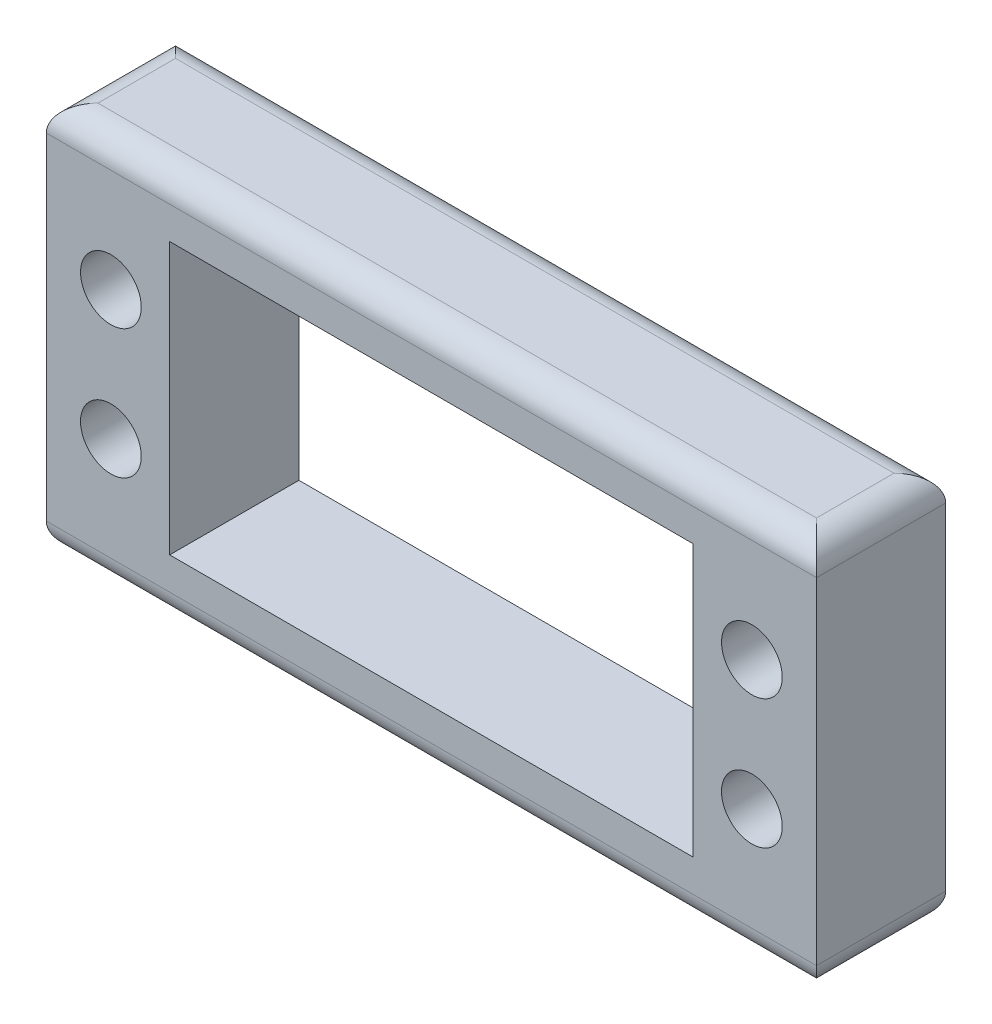
ISO-10303-21;
HEADER;
FILE_DESCRIPTION(('STEP AP214'),'2;1');
FILE_NAME('part.step','',(''),(''),'','','');
FILE_SCHEMA(('AUTOMOTIVE_DESIGN { 1 0 10303 214 1 1 1 1 }'));
ENDSEC;
DATA;
#1=APPLICATION_CONTEXT('core data for automotive mechanical design processes');
#2=APPLICATION_PROTOCOL_DEFINITION('international standard','automotive_design',2000,#1);
#3=PRODUCT_CONTEXT('',#1,'mechanical');
#4=PRODUCT('Part','Part','',(#3));
#5=PRODUCT_RELATED_PRODUCT_CATEGORY('part','',(#4));
#6=PRODUCT_DEFINITION_FORMATION('','',#4);
#7=PRODUCT_DEFINITION_CONTEXT('part definition',#1,'design');
#8=PRODUCT_DEFINITION('design','',#6,#7);
#9=PRODUCT_DEFINITION_SHAPE('','',#8);
#10=(LENGTH_UNIT() NAMED_UNIT(*) SI_UNIT(.MILLI.,.METRE.));
#11=(NAMED_UNIT(*) PLANE_ANGLE_UNIT() SI_UNIT($,.RADIAN.));
#12=(NAMED_UNIT(*) SI_UNIT($,.STERADIAN.) SOLID_ANGLE_UNIT());
#13=UNCERTAINTY_MEASURE_WITH_UNIT(LENGTH_MEASURE(1.E-05),#10,'distance_accuracy_value','');
#14=(GEOMETRIC_REPRESENTATION_CONTEXT(3) GLOBAL_UNCERTAINTY_ASSIGNED_CONTEXT((#13)) GLOBAL_UNIT_ASSIGNED_CONTEXT((#10,
#11,#12)) REPRESENTATION_CONTEXT('',''));
#15=CARTESIAN_POINT('',(0.,0.,0.));
#16=DIRECTION('',(0.,0.,1.));
#17=DIRECTION('',(1.,0.,0.));
#18=AXIS2_PLACEMENT_3D('',#15,#16,#17);
#19=CARTESIAN_POINT('',(0.,0.,10.));
#20=DIRECTION('',(0.,0.,1.));
#21=DIRECTION('',(1.,0.,0.));
#22=AXIS2_PLACEMENT_3D('',#19,#20,#21);
#23=PLANE('',#22);
#24=CARTESIAN_POINT('',(24.8,-5.,10.));
#25=DIRECTION('',(0.,0.,1.));
#26=DIRECTION('',(-1.,0.,0.));
#27=AXIS2_PLACEMENT_3D('',#24,#25,#26);
#28=CIRCLE('',#27,2.35);
#29=CARTESIAN_POINT('',(22.45,-5.,10.));
#30=VERTEX_POINT('',#29);
#31=EDGE_CURVE('E177',#30,#30,#28,.T.);
#32=ORIENTED_EDGE('',*,*,#31,.F.);
#33=EDGE_LOOP('',(#32));
#34=FACE_BOUND('',#33,.T.);
#35=CARTESIAN_POINT('',(-24.8,5.00000000000001,10.));
#36=DIRECTION('',(0.,0.,1.));
#37=DIRECTION('',(1.,0.,0.));
#38=AXIS2_PLACEMENT_3D('',#35,#36,#37);
#39=CIRCLE('',#38,2.34999999999999);
#40=CARTESIAN_POINT('',(-22.45,5.00000000000001,10.));
#41=VERTEX_POINT('',#40);
#42=EDGE_CURVE('E187',#41,#41,#39,.T.);
#43=ORIENTED_EDGE('',*,*,#42,.F.);
#44=EDGE_LOOP('',(#43));
#45=FACE_BOUND('',#44,.T.);
#46=DIRECTION('',(0.,-1.,0.));
#47=VECTOR('',#46,1.);
#48=CARTESIAN_POINT('',(-29.8,15.,10.));
#49=LINE('',#48,#47);
#50=CARTESIAN_POINT('',(-29.8,13.,10.));
#51=VERTEX_POINT('',#50);
#52=CARTESIAN_POINT('',(-29.8,-13.,10.));
#53=VERTEX_POINT('',#52);
#54=EDGE_CURVE('E195',#51,#53,#49,.T.);
#55=ORIENTED_EDGE('',*,*,#54,.T.);
#56=DIRECTION('',(1.,0.,0.));
#57=VECTOR('',#56,1.);
#58=CARTESIAN_POINT('',(29.8,-13.,10.));
#59=LINE('',#58,#57);
#60=CARTESIAN_POINT('',(29.8,-13.,10.));
#61=VERTEX_POINT('',#60);
#62=EDGE_CURVE('E225',#53,#61,#59,.T.);
#63=ORIENTED_EDGE('',*,*,#62,.T.);
#64=DIRECTION('',(0.,1.,0.));
#65=VECTOR('',#64,1.);
#66=CARTESIAN_POINT('',(29.8,15.,10.));
#67=LINE('',#66,#65);
#68=CARTESIAN_POINT('',(29.8,13.,10.));
#69=VERTEX_POINT('',#68);
#70=EDGE_CURVE('E196',#61,#69,#67,.T.);
#71=ORIENTED_EDGE('',*,*,#70,.T.);
#72=DIRECTION('',(-1.,0.,0.));
#73=VECTOR('',#72,1.);
#74=CARTESIAN_POINT('',(-29.8,13.,10.));
#75=LINE('',#74,#73);
#76=EDGE_CURVE('E219',#69,#51,#75,.T.);
#77=ORIENTED_EDGE('',*,*,#76,.T.);
#78=EDGE_LOOP('',(#55,#63,#71,#77));
#79=FACE_BOUND('',#78,.T.);
#80=CARTESIAN_POINT('',(24.8,5.00000000000002,10.));
#81=DIRECTION('',(0.,0.,1.));
#82=DIRECTION('',(1.,0.,0.));
#83=AXIS2_PLACEMENT_3D('',#80,#81,#82);
#84=CIRCLE('',#83,2.34999999999998);
#85=CARTESIAN_POINT('',(27.15,5.00000000000002,10.));
#86=VERTEX_POINT('',#85);
#87=EDGE_CURVE('E181',#86,#86,#84,.T.);
#88=ORIENTED_EDGE('',*,*,#87,.F.);
#89=EDGE_LOOP('',(#88));
#90=FACE_BOUND('',#89,.T.);
#91=CARTESIAN_POINT('',(-24.8,-4.99999999999999,10.));
#92=DIRECTION('',(0.,0.,1.));
#93=DIRECTION('',(-1.,0.,0.));
#94=AXIS2_PLACEMENT_3D('',#91,#92,#93);
#95=CIRCLE('',#94,2.35);
#96=CARTESIAN_POINT('',(-27.15,-4.99999999999999,10.));
#97=VERTEX_POINT('',#96);
#98=EDGE_CURVE('E173',#97,#97,#95,.T.);
#99=ORIENTED_EDGE('',*,*,#98,.F.);
#100=EDGE_LOOP('',(#99));
#101=FACE_BOUND('',#100,.T.);
#102=DIRECTION('',(-1.,0.,0.));
#103=VECTOR('',#102,1.);
#104=CARTESIAN_POINT('',(-20.25,10.5,10.));
#105=LINE('',#104,#103);
#106=CARTESIAN_POINT('',(20.25,10.5,10.));
#107=VERTEX_POINT('',#106);
#108=CARTESIAN_POINT('',(-20.25,10.5,10.));
#109=VERTEX_POINT('',#108);
#110=EDGE_CURVE('E138',#107,#109,#105,.T.);
#111=ORIENTED_EDGE('',*,*,#110,.F.);
#112=DIRECTION('',(0.,1.,0.));
#113=VECTOR('',#112,1.);
#114=CARTESIAN_POINT('',(20.25,10.5,10.));
#115=LINE('',#114,#113);
#116=CARTESIAN_POINT('',(20.25,-10.5,10.));
#117=VERTEX_POINT('',#116);
#118=EDGE_CURVE('E129',#117,#107,#115,.T.);
#119=ORIENTED_EDGE('',*,*,#118,.F.);
#120=DIRECTION('',(1.,0.,0.));
#121=VECTOR('',#120,1.);
#122=CARTESIAN_POINT('',(-20.25,-10.5,10.));
#123=LINE('',#122,#121);
#124=CARTESIAN_POINT('',(-20.25,-10.5,10.));
#125=VERTEX_POINT('',#124);
#126=EDGE_CURVE('E152',#125,#117,#123,.T.);
#127=ORIENTED_EDGE('',*,*,#126,.F.);
#128=DIRECTION('',(0.,-1.,0.));
#129=VECTOR('',#128,1.);
#130=CARTESIAN_POINT('',(-20.25,10.5,10.));
#131=LINE('',#130,#129);
#132=EDGE_CURVE('E155',#109,#125,#131,.T.);
#133=ORIENTED_EDGE('',*,*,#132,.F.);
#134=EDGE_LOOP('',(#111,#119,#127,#133));
#135=FACE_BOUND('',#134,.T.);
#136=ADVANCED_FACE('F39',(#34,#45,#79,#90,#101,#135),#23,.T.);
#137=CARTESIAN_POINT('',(0.,0.,0.));
#138=DIRECTION('',(0.,0.,1.));
#139=DIRECTION('',(1.,0.,0.));
#140=AXIS2_PLACEMENT_3D('',#137,#138,#139);
#141=PLANE('',#140);
#142=CARTESIAN_POINT('',(-24.8,-4.99999999999999,0.));
#143=DIRECTION('',(0.,0.,1.));
#144=DIRECTION('',(-1.,0.,0.));
#145=AXIS2_PLACEMENT_3D('',#142,#143,#144);
#146=CIRCLE('',#145,2.35);
#147=CARTESIAN_POINT('',(-27.15,-4.99999999999999,0.));
#148=VERTEX_POINT('',#147);
#149=EDGE_CURVE('E150',#148,#148,#146,.T.);
#150=ORIENTED_EDGE('',*,*,#149,.T.);
#151=EDGE_LOOP('',(#150));
#152=FACE_BOUND('',#151,.T.);
#153=CARTESIAN_POINT('',(24.8,-5.,0.));
#154=DIRECTION('',(0.,0.,1.));
#155=DIRECTION('',(-1.,0.,0.));
#156=AXIS2_PLACEMENT_3D('',#153,#154,#155);
#157=CIRCLE('',#156,2.35);
#158=CARTESIAN_POINT('',(22.45,-5.,0.));
#159=VERTEX_POINT('',#158);
#160=EDGE_CURVE('E172',#159,#159,#157,.T.);
#161=ORIENTED_EDGE('',*,*,#160,.T.);
#162=EDGE_LOOP('',(#161));
#163=FACE_BOUND('',#162,.T.);
#164=CARTESIAN_POINT('',(24.8,5.00000000000002,0.));
#165=DIRECTION('',(0.,0.,1.));
#166=DIRECTION('',(1.,0.,0.));
#167=AXIS2_PLACEMENT_3D('',#164,#165,#166);
#168=CIRCLE('',#167,2.34999999999998);
#169=CARTESIAN_POINT('',(27.15,5.00000000000002,0.));
#170=VERTEX_POINT('',#169);
#171=EDGE_CURVE('E180',#170,#170,#168,.T.);
#172=ORIENTED_EDGE('',*,*,#171,.T.);
#173=EDGE_LOOP('',(#172));
#174=FACE_BOUND('',#173,.T.);
#175=CARTESIAN_POINT('',(-24.8,5.00000000000001,0.));
#176=DIRECTION('',(0.,0.,1.));
#177=DIRECTION('',(1.,0.,0.));
#178=AXIS2_PLACEMENT_3D('',#175,#176,#177);
#179=CIRCLE('',#178,2.34999999999999);
#180=CARTESIAN_POINT('',(-22.45,5.00000000000001,0.));
#181=VERTEX_POINT('',#180);
#182=EDGE_CURVE('E188',#181,#181,#179,.T.);
#183=ORIENTED_EDGE('',*,*,#182,.T.);
#184=EDGE_LOOP('',(#183));
#185=FACE_BOUND('',#184,.T.);
#186=DIRECTION('',(0.,1.,0.));
#187=VECTOR('',#186,1.);
#188=CARTESIAN_POINT('',(29.8,15.,0.));
#189=LINE('',#188,#187);
#190=CARTESIAN_POINT('',(29.8,-13.,0.));
#191=VERTEX_POINT('',#190);
#192=CARTESIAN_POINT('',(29.8,13.,0.));
#193=VERTEX_POINT('',#192);
#194=EDGE_CURVE('E200',#191,#193,#189,.T.);
#195=ORIENTED_EDGE('',*,*,#194,.F.);
#196=DIRECTION('',(1.,0.,0.));
#197=VECTOR('',#196,1.);
#198=CARTESIAN_POINT('',(0.,-13.,0.));
#199=LINE('',#198,#197);
#200=CARTESIAN_POINT('',(-29.8,-13.,0.));
#201=VERTEX_POINT('',#200);
#202=EDGE_CURVE('E231',#191,#201,#199,.F.);
#203=ORIENTED_EDGE('',*,*,#202,.T.);
#204=DIRECTION('',(0.,-1.,0.));
#205=VECTOR('',#204,1.);
#206=CARTESIAN_POINT('',(-29.8,15.,0.));
#207=LINE('',#206,#205);
#208=CARTESIAN_POINT('',(-29.8,13.,0.));
#209=VERTEX_POINT('',#208);
#210=EDGE_CURVE('E192',#209,#201,#207,.T.);
#211=ORIENTED_EDGE('',*,*,#210,.F.);
#212=DIRECTION('',(-1.,0.,0.));
#213=VECTOR('',#212,1.);
#214=CARTESIAN_POINT('',(0.,13.,0.));
#215=LINE('',#214,#213);
#216=EDGE_CURVE('E227',#209,#193,#215,.F.);
#217=ORIENTED_EDGE('',*,*,#216,.T.);
#218=EDGE_LOOP('',(#195,#203,#211,#217));
#219=FACE_BOUND('',#218,.T.);
#220=DIRECTION('',(0.,1.,0.));
#221=VECTOR('',#220,1.);
#222=CARTESIAN_POINT('',(20.25,10.5,0.));
#223=LINE('',#222,#221);
#224=CARTESIAN_POINT('',(20.25,-10.5,0.));
#225=VERTEX_POINT('',#224);
#226=CARTESIAN_POINT('',(20.25,10.5,0.));
#227=VERTEX_POINT('',#226);
#228=EDGE_CURVE('E158',#225,#227,#223,.T.);
#229=ORIENTED_EDGE('',*,*,#228,.T.);
#230=DIRECTION('',(-1.,0.,0.));
#231=VECTOR('',#230,1.);
#232=CARTESIAN_POINT('',(-20.25,10.5,0.));
#233=LINE('',#232,#231);
#234=CARTESIAN_POINT('',(-20.25,10.5,0.));
#235=VERTEX_POINT('',#234);
#236=EDGE_CURVE('E148',#227,#235,#233,.T.);
#237=ORIENTED_EDGE('',*,*,#236,.T.);
#238=DIRECTION('',(0.,-1.,0.));
#239=VECTOR('',#238,1.);
#240=CARTESIAN_POINT('',(-20.25,10.5,0.));
#241=LINE('',#240,#239);
#242=CARTESIAN_POINT('',(-20.25,-10.5,0.));
#243=VERTEX_POINT('',#242);
#244=EDGE_CURVE('E165',#235,#243,#241,.T.);
#245=ORIENTED_EDGE('',*,*,#244,.T.);
#246=DIRECTION('',(1.,0.,0.));
#247=VECTOR('',#246,1.);
#248=CARTESIAN_POINT('',(-20.25,-10.5,0.));
#249=LINE('',#248,#247);
#250=EDGE_CURVE('E140',#243,#225,#249,.T.);
#251=ORIENTED_EDGE('',*,*,#250,.T.);
#252=EDGE_LOOP('',(#229,#237,#245,#251));
#253=FACE_BOUND('',#252,.T.);
#254=ADVANCED_FACE('F268',(#152,#163,#174,#185,#219,#253),#141,.F.);
#255=CARTESIAN_POINT('',(-29.8,15.,10.));
#256=DIRECTION('',(1.,0.,0.));
#257=DIRECTION('',(0.,0.,-1.));
#258=AXIS2_PLACEMENT_3D('',#255,#256,#257);
#259=PLANE('',#258);
#260=ORIENTED_EDGE('',*,*,#210,.T.);
#261=DIRECTION('',(0.,0.,-1.));
#262=VECTOR('',#261,1.);
#263=CARTESIAN_POINT('',(-29.8,-13.,10.));
#264=LINE('',#263,#262);
#265=EDGE_CURVE('E220',#201,#53,#264,.F.);
#266=ORIENTED_EDGE('',*,*,#265,.T.);
#267=ORIENTED_EDGE('',*,*,#54,.F.);
#268=DIRECTION('',(0.,0.,-1.));
#269=VECTOR('',#268,1.);
#270=CARTESIAN_POINT('',(-29.8,13.,10.));
#271=LINE('',#270,#269);
#272=EDGE_CURVE('E214',#51,#209,#271,.T.);
#273=ORIENTED_EDGE('',*,*,#272,.T.);
#274=EDGE_LOOP('',(#260,#266,#267,#273));
#275=FACE_BOUND('',#274,.T.);
#276=ADVANCED_FACE('F262',(#275),#259,.F.);
#277=CARTESIAN_POINT('',(-29.8,-15.,10.));
#278=DIRECTION('',(0.,1.,0.));
#279=DIRECTION('',(0.,0.,1.));
#280=AXIS2_PLACEMENT_3D('',#277,#278,#279);
#281=PLANE('',#280);
#282=DIRECTION('',(1.,0.,0.));
#283=VECTOR('',#282,1.);
#284=CARTESIAN_POINT('',(-29.8,-15.,8.));
#285=LINE('',#284,#283);
#286=CARTESIAN_POINT('',(27.8,-15.,8.));
#287=VERTEX_POINT('',#286);
#288=CARTESIAN_POINT('',(-27.8,-15.,8.));
#289=VERTEX_POINT('',#288);
#290=EDGE_CURVE('E209',#287,#289,#285,.F.);
#291=ORIENTED_EDGE('',*,*,#290,.T.);
#292=DIRECTION('',(0.,0.,-1.));
#293=VECTOR('',#292,1.);
#294=CARTESIAN_POINT('',(-27.8,-15.,10.));
#295=LINE('',#294,#293);
#296=CARTESIAN_POINT('',(-27.8,-15.,2.));
#297=VERTEX_POINT('',#296);
#298=EDGE_CURVE('E215',#289,#297,#295,.T.);
#299=ORIENTED_EDGE('',*,*,#298,.T.);
#300=DIRECTION('',(1.,0.,0.));
#301=VECTOR('',#300,1.);
#302=CARTESIAN_POINT('',(-29.8,-15.,2.));
#303=LINE('',#302,#301);
#304=CARTESIAN_POINT('',(27.8,-15.,2.));
#305=VERTEX_POINT('',#304);
#306=EDGE_CURVE('E205',#297,#305,#303,.T.);
#307=ORIENTED_EDGE('',*,*,#306,.T.);
#308=DIRECTION('',(0.,0.,-1.));
#309=VECTOR('',#308,1.);
#310=CARTESIAN_POINT('',(27.8,-15.,10.));
#311=LINE('',#310,#309);
#312=EDGE_CURVE('E208',#305,#287,#311,.F.);
#313=ORIENTED_EDGE('',*,*,#312,.T.);
#314=EDGE_LOOP('',(#291,#299,#307,#313));
#315=FACE_BOUND('',#314,.T.);
#316=ADVANCED_FACE('F298',(#315),#281,.F.);
#317=CARTESIAN_POINT('',(29.8,15.,10.));
#318=DIRECTION('',(-1.,0.,0.));
#319=DIRECTION('',(0.,0.,1.));
#320=AXIS2_PLACEMENT_3D('',#317,#318,#319);
#321=PLANE('',#320);
#322=ORIENTED_EDGE('',*,*,#70,.F.);
#323=DIRECTION('',(0.,0.,-1.));
#324=VECTOR('',#323,1.);
#325=CARTESIAN_POINT('',(29.8,-13.,10.));
#326=LINE('',#325,#324);
#327=EDGE_CURVE('E230',#61,#191,#326,.T.);
#328=ORIENTED_EDGE('',*,*,#327,.T.);
#329=ORIENTED_EDGE('',*,*,#194,.T.);
#330=DIRECTION('',(0.,0.,-1.));
#331=VECTOR('',#330,1.);
#332=CARTESIAN_POINT('',(29.8,13.,10.));
#333=LINE('',#332,#331);
#334=EDGE_CURVE('E221',#193,#69,#333,.F.);
#335=ORIENTED_EDGE('',*,*,#334,.T.);
#336=EDGE_LOOP('',(#322,#328,#329,#335));
#337=FACE_BOUND('',#336,.T.);
#338=ADVANCED_FACE('F286',(#337),#321,.F.);
#339=CARTESIAN_POINT('',(-29.8,15.,10.));
#340=DIRECTION('',(0.,-1.,0.));
#341=DIRECTION('',(0.,0.,-1.));
#342=AXIS2_PLACEMENT_3D('',#339,#340,#341);
#343=PLANE('',#342);
#344=DIRECTION('',(-1.,0.,0.));
#345=VECTOR('',#344,1.);
#346=CARTESIAN_POINT('',(29.8,15.,8.));
#347=LINE('',#346,#345);
#348=CARTESIAN_POINT('',(-27.8,15.,8.));
#349=VERTEX_POINT('',#348);
#350=CARTESIAN_POINT('',(27.8,15.,8.));
#351=VERTEX_POINT('',#350);
#352=EDGE_CURVE('E48',#349,#351,#347,.F.);
#353=ORIENTED_EDGE('',*,*,#352,.T.);
#354=DIRECTION('',(0.,0.,-1.));
#355=VECTOR('',#354,1.);
#356=CARTESIAN_POINT('',(27.8,15.,10.));
#357=LINE('',#356,#355);
#358=CARTESIAN_POINT('',(27.8,15.,2.));
#359=VERTEX_POINT('',#358);
#360=EDGE_CURVE('E11',#351,#359,#357,.T.);
#361=ORIENTED_EDGE('',*,*,#360,.T.);
#362=DIRECTION('',(-1.,0.,0.));
#363=VECTOR('',#362,1.);
#364=CARTESIAN_POINT('',(-29.8,15.,2.));
#365=LINE('',#364,#363);
#366=CARTESIAN_POINT('',(-27.8,15.,2.));
#367=VERTEX_POINT('',#366);
#368=EDGE_CURVE('E234',#359,#367,#365,.T.);
#369=ORIENTED_EDGE('',*,*,#368,.T.);
#370=DIRECTION('',(0.,0.,-1.));
#371=VECTOR('',#370,1.);
#372=CARTESIAN_POINT('',(-27.8,15.,10.));
#373=LINE('',#372,#371);
#374=EDGE_CURVE('E56',#367,#349,#373,.F.);
#375=ORIENTED_EDGE('',*,*,#374,.T.);
#376=EDGE_LOOP('',(#353,#361,#369,#375));
#377=FACE_BOUND('',#376,.T.);
#378=ADVANCED_FACE('F304',(#377),#343,.F.);
#379=CARTESIAN_POINT('',(-24.8,5.00000000000001,10.));
#380=DIRECTION('',(0.,0.,-1.));
#381=DIRECTION('',(-1.,0.,0.));
#382=AXIS2_PLACEMENT_3D('',#379,#380,#381);
#383=CYLINDRICAL_SURFACE('',#382,2.34999999999999);
#384=ORIENTED_EDGE('',*,*,#42,.T.);
#385=EDGE_LOOP('',(#384));
#386=FACE_BOUND('',#385,.T.);
#387=ORIENTED_EDGE('',*,*,#182,.F.);
#388=EDGE_LOOP('',(#387));
#389=FACE_BOUND('',#388,.T.);
#390=ADVANCED_FACE('F318',(#386,#389),#383,.F.);
#391=CARTESIAN_POINT('',(24.8,5.00000000000002,10.));
#392=DIRECTION('',(0.,0.,-1.));
#393=DIRECTION('',(-1.,0.,0.));
#394=AXIS2_PLACEMENT_3D('',#391,#392,#393);
#395=CYLINDRICAL_SURFACE('',#394,2.34999999999998);
#396=ORIENTED_EDGE('',*,*,#87,.T.);
#397=EDGE_LOOP('',(#396));
#398=FACE_BOUND('',#397,.T.);
#399=ORIENTED_EDGE('',*,*,#171,.F.);
#400=EDGE_LOOP('',(#399));
#401=FACE_BOUND('',#400,.T.);
#402=ADVANCED_FACE('F326',(#398,#401),#395,.F.);
#403=CARTESIAN_POINT('',(24.8,-5.,10.));
#404=DIRECTION('',(0.,0.,-1.));
#405=DIRECTION('',(-1.,0.,0.));
#406=AXIS2_PLACEMENT_3D('',#403,#404,#405);
#407=CYLINDRICAL_SURFACE('',#406,2.35);
#408=ORIENTED_EDGE('',*,*,#31,.T.);
#409=EDGE_LOOP('',(#408));
#410=FACE_BOUND('',#409,.T.);
#411=ORIENTED_EDGE('',*,*,#160,.F.);
#412=EDGE_LOOP('',(#411));
#413=FACE_BOUND('',#412,.T.);
#414=ADVANCED_FACE('F332',(#410,#413),#407,.F.);
#415=CARTESIAN_POINT('',(-24.8,-4.99999999999999,10.));
#416=DIRECTION('',(0.,0.,-1.));
#417=DIRECTION('',(-1.,0.,0.));
#418=AXIS2_PLACEMENT_3D('',#415,#416,#417);
#419=CYLINDRICAL_SURFACE('',#418,2.35);
#420=ORIENTED_EDGE('',*,*,#98,.T.);
#421=EDGE_LOOP('',(#420));
#422=FACE_BOUND('',#421,.T.);
#423=ORIENTED_EDGE('',*,*,#149,.F.);
#424=EDGE_LOOP('',(#423));
#425=FACE_BOUND('',#424,.T.);
#426=ADVANCED_FACE('F339',(#422,#425),#419,.F.);
#427=CARTESIAN_POINT('',(20.25,10.5,10.));
#428=DIRECTION('',(-1.,0.,0.));
#429=DIRECTION('',(0.,-1.,0.));
#430=AXIS2_PLACEMENT_3D('',#427,#428,#429);
#431=PLANE('',#430);
#432=ORIENTED_EDGE('',*,*,#228,.F.);
#433=DIRECTION('',(0.,0.,-1.));
#434=VECTOR('',#433,1.);
#435=CARTESIAN_POINT('',(20.25,-10.5,10.));
#436=LINE('',#435,#434);
#437=EDGE_CURVE('E134',#117,#225,#436,.T.);
#438=ORIENTED_EDGE('',*,*,#437,.F.);
#439=ORIENTED_EDGE('',*,*,#118,.T.);
#440=DIRECTION('',(0.,0.,-1.));
#441=VECTOR('',#440,1.);
#442=CARTESIAN_POINT('',(20.25,10.5,10.));
#443=LINE('',#442,#441);
#444=EDGE_CURVE('E135',#107,#227,#443,.T.);
#445=ORIENTED_EDGE('',*,*,#444,.T.);
#446=EDGE_LOOP('',(#432,#438,#439,#445));
#447=FACE_BOUND('',#446,.T.);
#448=ADVANCED_FACE('F133',(#447),#431,.T.);
#449=CARTESIAN_POINT('',(-20.25,10.5,10.));
#450=DIRECTION('',(0.,-1.,0.));
#451=DIRECTION('',(0.,0.,-1.));
#452=AXIS2_PLACEMENT_3D('',#449,#450,#451);
#453=PLANE('',#452);
#454=ORIENTED_EDGE('',*,*,#236,.F.);
#455=ORIENTED_EDGE('',*,*,#444,.F.);
#456=ORIENTED_EDGE('',*,*,#110,.T.);
#457=DIRECTION('',(0.,0.,-1.));
#458=VECTOR('',#457,1.);
#459=CARTESIAN_POINT('',(-20.25,10.5,10.));
#460=LINE('',#459,#458);
#461=EDGE_CURVE('E146',#109,#235,#460,.T.);
#462=ORIENTED_EDGE('',*,*,#461,.T.);
#463=EDGE_LOOP('',(#454,#455,#456,#462));
#464=FACE_BOUND('',#463,.T.);
#465=ADVANCED_FACE('F141',(#464),#453,.T.);
#466=CARTESIAN_POINT('',(-20.25,10.5,10.));
#467=DIRECTION('',(1.,0.,0.));
#468=DIRECTION('',(0.,0.,-1.));
#469=AXIS2_PLACEMENT_3D('',#466,#467,#468);
#470=PLANE('',#469);
#471=ORIENTED_EDGE('',*,*,#244,.F.);
#472=ORIENTED_EDGE('',*,*,#461,.F.);
#473=ORIENTED_EDGE('',*,*,#132,.T.);
#474=DIRECTION('',(0.,0.,-1.));
#475=VECTOR('',#474,1.);
#476=CARTESIAN_POINT('',(-20.25,-10.5,10.));
#477=LINE('',#476,#475);
#478=EDGE_CURVE('E169',#125,#243,#477,.T.);
#479=ORIENTED_EDGE('',*,*,#478,.T.);
#480=EDGE_LOOP('',(#471,#472,#473,#479));
#481=FACE_BOUND('',#480,.T.);
#482=ADVANCED_FACE('F355',(#481),#470,.T.);
#483=CARTESIAN_POINT('',(-20.25,-10.5,10.));
#484=DIRECTION('',(0.,1.,0.));
#485=DIRECTION('',(0.,0.,1.));
#486=AXIS2_PLACEMENT_3D('',#483,#484,#485);
#487=PLANE('',#486);
#488=ORIENTED_EDGE('',*,*,#250,.F.);
#489=ORIENTED_EDGE('',*,*,#478,.F.);
#490=ORIENTED_EDGE('',*,*,#126,.T.);
#491=ORIENTED_EDGE('',*,*,#437,.T.);
#492=EDGE_LOOP('',(#488,#489,#490,#491));
#493=FACE_BOUND('',#492,.T.);
#494=ADVANCED_FACE('F354',(#493),#487,.T.);
#495=CARTESIAN_POINT('',(27.8,-13.,10.));
#496=DIRECTION('',(0.,0.,-1.));
#497=DIRECTION('',(-1.,0.,0.));
#498=AXIS2_PLACEMENT_3D('',#495,#496,#497);
#499=CYLINDRICAL_SURFACE('',#498,2.);
#500=CARTESIAN_POINT('',(27.8,-13.,2.));
#501=DIRECTION('',(0.707106781186547,0.,0.707106781186547));
#502=DIRECTION('',(0.707106781186547,0.,-0.707106781186547));
#503=AXIS2_PLACEMENT_3D('',#500,#501,#502);
#504=ELLIPSE('',#503,2.82842712474619,2.);
#505=EDGE_CURVE('E243',#191,#305,#504,.F.);
#506=ORIENTED_EDGE('',*,*,#505,.F.);
#507=ORIENTED_EDGE('',*,*,#327,.F.);
#508=CARTESIAN_POINT('',(27.8,-13.,8.));
#509=DIRECTION('',(0.707106781186547,0.,-0.707106781186547));
#510=DIRECTION('',(-0.707106781186547,0.,-0.707106781186547));
#511=AXIS2_PLACEMENT_3D('',#508,#509,#510);
#512=ELLIPSE('',#511,2.82842712474619,2.);
#513=EDGE_CURVE('E159',#287,#61,#512,.F.);
#514=ORIENTED_EDGE('',*,*,#513,.F.);
#515=ORIENTED_EDGE('',*,*,#312,.F.);
#516=EDGE_LOOP('',(#506,#507,#514,#515));
#517=FACE_BOUND('',#516,.T.);
#518=ADVANCED_FACE('F290',(#517),#499,.T.);
#519=CARTESIAN_POINT('',(0.,-13.,8.));
#520=DIRECTION('',(-1.,0.,0.));
#521=DIRECTION('',(0.,0.,1.));
#522=AXIS2_PLACEMENT_3D('',#519,#520,#521);
#523=CYLINDRICAL_SURFACE('',#522,2.);
#524=ORIENTED_EDGE('',*,*,#513,.T.);
#525=ORIENTED_EDGE('',*,*,#62,.F.);
#526=CARTESIAN_POINT('',(-27.8,-13.,8.));
#527=DIRECTION('',(-0.707106781186547,0.,-0.707106781186547));
#528=DIRECTION('',(-0.707106781186547,0.,0.707106781186547));
#529=AXIS2_PLACEMENT_3D('',#526,#527,#528);
#530=ELLIPSE('',#529,2.82842712474619,2.);
#531=EDGE_CURVE('E239',#289,#53,#530,.T.);
#532=ORIENTED_EDGE('',*,*,#531,.F.);
#533=ORIENTED_EDGE('',*,*,#290,.F.);
#534=EDGE_LOOP('',(#524,#525,#532,#533));
#535=FACE_BOUND('',#534,.T.);
#536=ADVANCED_FACE('F294',(#535),#523,.T.);
#537=CARTESIAN_POINT('',(-29.8,-13.,2.));
#538=DIRECTION('',(1.,0.,0.));
#539=DIRECTION('',(0.,0.,-1.));
#540=AXIS2_PLACEMENT_3D('',#537,#538,#539);
#541=CYLINDRICAL_SURFACE('',#540,2.);
#542=ORIENTED_EDGE('',*,*,#505,.T.);
#543=ORIENTED_EDGE('',*,*,#306,.F.);
#544=CARTESIAN_POINT('',(-27.8,-13.,2.));
#545=DIRECTION('',(0.707106781186547,0.,-0.707106781186547));
#546=DIRECTION('',(0.707106781186547,0.,0.707106781186547));
#547=AXIS2_PLACEMENT_3D('',#544,#545,#546);
#548=ELLIPSE('',#547,2.82842712474619,2.);
#549=EDGE_CURVE('E240',#201,#297,#548,.F.);
#550=ORIENTED_EDGE('',*,*,#549,.F.);
#551=ORIENTED_EDGE('',*,*,#202,.F.);
#552=EDGE_LOOP('',(#542,#543,#550,#551));
#553=FACE_BOUND('',#552,.T.);
#554=ADVANCED_FACE('F273',(#553),#541,.T.);
#555=CARTESIAN_POINT('',(-27.8,-13.,10.));
#556=DIRECTION('',(0.,0.,-1.));
#557=DIRECTION('',(-1.,0.,0.));
#558=AXIS2_PLACEMENT_3D('',#555,#556,#557);
#559=CYLINDRICAL_SURFACE('',#558,2.);
#560=ORIENTED_EDGE('',*,*,#531,.T.);
#561=ORIENTED_EDGE('',*,*,#265,.F.);
#562=ORIENTED_EDGE('',*,*,#549,.T.);
#563=ORIENTED_EDGE('',*,*,#298,.F.);
#564=EDGE_LOOP('',(#560,#561,#562,#563));
#565=FACE_BOUND('',#564,.T.);
#566=ADVANCED_FACE('F279',(#565),#559,.T.);
#567=CARTESIAN_POINT('',(-27.8,13.,10.));
#568=DIRECTION('',(0.,0.,-1.));
#569=DIRECTION('',(-1.,0.,0.));
#570=AXIS2_PLACEMENT_3D('',#567,#568,#569);
#571=CYLINDRICAL_SURFACE('',#570,2.);
#572=CARTESIAN_POINT('',(-27.8,13.,2.));
#573=DIRECTION('',(-0.707106781186547,0.,0.707106781186547));
#574=DIRECTION('',(-0.707106781186547,0.,-0.707106781186547));
#575=AXIS2_PLACEMENT_3D('',#572,#573,#574);
#576=ELLIPSE('',#575,2.82842712474619,2.);
#577=EDGE_CURVE('E248',#209,#367,#576,.F.);
#578=ORIENTED_EDGE('',*,*,#577,.F.);
#579=ORIENTED_EDGE('',*,*,#272,.F.);
#580=CARTESIAN_POINT('',(-27.8,13.,8.));
#581=DIRECTION('',(-0.707106781186547,0.,-0.707106781186547));
#582=DIRECTION('',(0.707106781186547,0.,-0.707106781186547));
#583=AXIS2_PLACEMENT_3D('',#580,#581,#582);
#584=ELLIPSE('',#583,2.82842712474619,2.);
#585=EDGE_CURVE('E43',#349,#51,#584,.F.);
#586=ORIENTED_EDGE('',*,*,#585,.F.);
#587=ORIENTED_EDGE('',*,*,#374,.F.);
#588=EDGE_LOOP('',(#578,#579,#586,#587));
#589=FACE_BOUND('',#588,.T.);
#590=ADVANCED_FACE('F41',(#589),#571,.T.);
#591=CARTESIAN_POINT('',(0.,13.,8.));
#592=DIRECTION('',(1.,0.,0.));
#593=DIRECTION('',(0.,0.,-1.));
#594=AXIS2_PLACEMENT_3D('',#591,#592,#593);
#595=CYLINDRICAL_SURFACE('',#594,2.);
#596=ORIENTED_EDGE('',*,*,#585,.T.);
#597=ORIENTED_EDGE('',*,*,#76,.F.);
#598=CARTESIAN_POINT('',(27.8,13.,8.));
#599=DIRECTION('',(0.707106781186547,0.,-0.707106781186547));
#600=DIRECTION('',(0.707106781186547,0.,0.707106781186547));
#601=AXIS2_PLACEMENT_3D('',#598,#599,#600);
#602=ELLIPSE('',#601,2.82842712474619,2.);
#603=EDGE_CURVE('E249',#351,#69,#602,.T.);
#604=ORIENTED_EDGE('',*,*,#603,.F.);
#605=ORIENTED_EDGE('',*,*,#352,.F.);
#606=EDGE_LOOP('',(#596,#597,#604,#605));
#607=FACE_BOUND('',#606,.T.);
#608=ADVANCED_FACE('F256',(#607),#595,.T.);
#609=CARTESIAN_POINT('',(-29.8,13.,2.));
#610=DIRECTION('',(-1.,0.,0.));
#611=DIRECTION('',(0.,0.,1.));
#612=AXIS2_PLACEMENT_3D('',#609,#610,#611);
#613=CYLINDRICAL_SURFACE('',#612,2.);
#614=ORIENTED_EDGE('',*,*,#577,.T.);
#615=ORIENTED_EDGE('',*,*,#368,.F.);
#616=CARTESIAN_POINT('',(27.8,13.,2.));
#617=DIRECTION('',(-0.707106781186547,0.,-0.707106781186547));
#618=DIRECTION('',(-0.707106781186547,0.,0.707106781186547));
#619=AXIS2_PLACEMENT_3D('',#616,#617,#618);
#620=ELLIPSE('',#619,2.82842712474619,2.);
#621=EDGE_CURVE('E246',#193,#359,#620,.F.);
#622=ORIENTED_EDGE('',*,*,#621,.F.);
#623=ORIENTED_EDGE('',*,*,#216,.F.);
#624=EDGE_LOOP('',(#614,#615,#622,#623));
#625=FACE_BOUND('',#624,.T.);
#626=ADVANCED_FACE('F375',(#625),#613,.T.);
#627=CARTESIAN_POINT('',(27.8,13.,10.));
#628=DIRECTION('',(0.,0.,-1.));
#629=DIRECTION('',(-1.,0.,0.));
#630=AXIS2_PLACEMENT_3D('',#627,#628,#629);
#631=CYLINDRICAL_SURFACE('',#630,2.);
#632=ORIENTED_EDGE('',*,*,#603,.T.);
#633=ORIENTED_EDGE('',*,*,#334,.F.);
#634=ORIENTED_EDGE('',*,*,#621,.T.);
#635=ORIENTED_EDGE('',*,*,#360,.F.);
#636=EDGE_LOOP('',(#632,#633,#634,#635));
#637=FACE_BOUND('',#636,.T.);
#638=ADVANCED_FACE('F369',(#637),#631,.T.);
#639=CLOSED_SHELL('',(#136,#254,#276,#316,#338,#378,#390,#402,#414,#426,#448,#465,#482,#494,
#518,#536,#554,#566,#590,#608,#626,#638));
#640=MANIFOLD_SOLID_BREP('B2',#639);
#641=ADVANCED_BREP_SHAPE_REPRESENTATION('',(#18,#640),#14);
#642=SHAPE_DEFINITION_REPRESENTATION(#9,#641);
ENDSEC;
END-ISO-10303-21;
